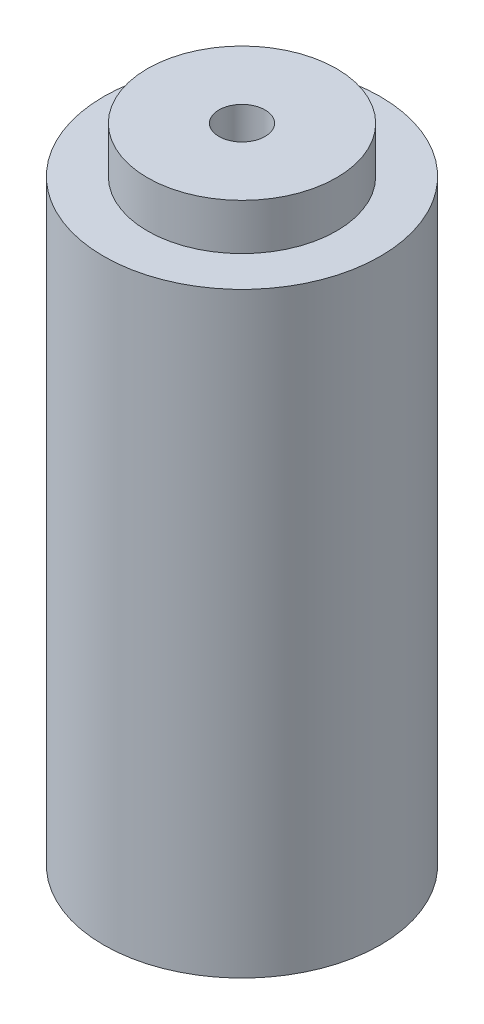
ISO-10303-21;
HEADER;
FILE_DESCRIPTION(('STEP AP214'),'2;1');
FILE_NAME('part.step','',(''),(''),'','','');
FILE_SCHEMA(('AUTOMOTIVE_DESIGN { 1 0 10303 214 1 1 1 1 }'));
ENDSEC;
DATA;
#1=APPLICATION_CONTEXT('core data for automotive mechanical design processes');
#2=APPLICATION_PROTOCOL_DEFINITION('international standard','automotive_design',2000,#1);
#3=PRODUCT_CONTEXT('',#1,'mechanical');
#4=PRODUCT('Part','Part','',(#3));
#5=PRODUCT_RELATED_PRODUCT_CATEGORY('part','',(#4));
#6=PRODUCT_DEFINITION_FORMATION('','',#4);
#7=PRODUCT_DEFINITION_CONTEXT('part definition',#1,'design');
#8=PRODUCT_DEFINITION('design','',#6,#7);
#9=PRODUCT_DEFINITION_SHAPE('','',#8);
#10=(LENGTH_UNIT() NAMED_UNIT(*) SI_UNIT(.MILLI.,.METRE.));
#11=(NAMED_UNIT(*) PLANE_ANGLE_UNIT() SI_UNIT($,.RADIAN.));
#12=(NAMED_UNIT(*) SI_UNIT($,.STERADIAN.) SOLID_ANGLE_UNIT());
#13=UNCERTAINTY_MEASURE_WITH_UNIT(LENGTH_MEASURE(1.E-05),#10,'distance_accuracy_value','');
#14=(GEOMETRIC_REPRESENTATION_CONTEXT(3) GLOBAL_UNCERTAINTY_ASSIGNED_CONTEXT((#13)) GLOBAL_UNIT_ASSIGNED_CONTEXT((#10,
#11,#12)) REPRESENTATION_CONTEXT('',''));
#15=CARTESIAN_POINT('',(0.,0.,0.));
#16=DIRECTION('',(0.,0.,1.));
#17=DIRECTION('',(1.,0.,0.));
#18=AXIS2_PLACEMENT_3D('',#15,#16,#17);
#19=CARTESIAN_POINT('',(0.,38.8,0.));
#20=DIRECTION('',(0.,1.,0.));
#21=DIRECTION('',(0.,0.,1.));
#22=AXIS2_PLACEMENT_3D('',#19,#20,#21);
#23=PLANE('',#22);
#24=CARTESIAN_POINT('',(0.,38.8,0.));
#25=DIRECTION('',(0.,1.,0.));
#26=DIRECTION('',(0.,0.,1.));
#27=AXIS2_PLACEMENT_3D('',#24,#25,#26);
#28=CIRCLE('',#27,9.);
#29=CARTESIAN_POINT('',(0.,38.8,9.));
#30=VERTEX_POINT('',#29);
#31=EDGE_CURVE('E10',#30,#30,#28,.T.);
#32=ORIENTED_EDGE('',*,*,#31,.T.);
#33=EDGE_LOOP('',(#32));
#34=FACE_BOUND('',#33,.T.);
#35=CARTESIAN_POINT('',(0.,38.8,0.));
#36=DIRECTION('',(0.,1.,0.));
#37=DIRECTION('',(0.,0.,1.));
#38=AXIS2_PLACEMENT_3D('',#35,#36,#37);
#39=CIRCLE('',#38,6.15);
#40=CARTESIAN_POINT('',(0.,38.8,6.15));
#41=VERTEX_POINT('',#40);
#42=EDGE_CURVE('E45',#41,#41,#39,.T.);
#43=ORIENTED_EDGE('',*,*,#42,.F.);
#44=EDGE_LOOP('',(#43));
#45=FACE_BOUND('',#44,.T.);
#46=ADVANCED_FACE('F34',(#34,#45),#23,.T.);
#47=CARTESIAN_POINT('',(0.,0.,0.));
#48=DIRECTION('',(0.,1.,0.));
#49=DIRECTION('',(0.,0.,1.));
#50=AXIS2_PLACEMENT_3D('',#47,#48,#49);
#51=PLANE('',#50);
#52=CARTESIAN_POINT('',(0.,0.,0.));
#53=DIRECTION('',(0.,1.,0.));
#54=DIRECTION('',(0.,0.,1.));
#55=AXIS2_PLACEMENT_3D('',#52,#53,#54);
#56=CIRCLE('',#55,1.5);
#57=CARTESIAN_POINT('',(0.,0.,1.5));
#58=VERTEX_POINT('',#57);
#59=EDGE_CURVE('E52',#58,#58,#56,.T.);
#60=ORIENTED_EDGE('',*,*,#59,.T.);
#61=EDGE_LOOP('',(#60));
#62=FACE_BOUND('',#61,.T.);
#63=CARTESIAN_POINT('',(0.,0.,0.));
#64=DIRECTION('',(0.,1.,0.));
#65=DIRECTION('',(0.,0.,1.));
#66=AXIS2_PLACEMENT_3D('',#63,#64,#65);
#67=CIRCLE('',#66,9.);
#68=CARTESIAN_POINT('',(0.,0.,9.));
#69=VERTEX_POINT('',#68);
#70=EDGE_CURVE('E38',#69,#69,#67,.T.);
#71=ORIENTED_EDGE('',*,*,#70,.F.);
#72=EDGE_LOOP('',(#71));
#73=FACE_BOUND('',#72,.T.);
#74=ADVANCED_FACE('F59',(#62,#73),#51,.F.);
#75=CARTESIAN_POINT('',(0.,38.8,0.));
#76=DIRECTION('',(0.,-1.,0.));
#77=DIRECTION('',(0.,0.,-1.));
#78=AXIS2_PLACEMENT_3D('',#75,#76,#77);
#79=CYLINDRICAL_SURFACE('',#78,9.);
#80=ORIENTED_EDGE('',*,*,#31,.F.);
#81=EDGE_LOOP('',(#80));
#82=FACE_BOUND('',#81,.T.);
#83=ORIENTED_EDGE('',*,*,#70,.T.);
#84=EDGE_LOOP('',(#83));
#85=FACE_BOUND('',#84,.T.);
#86=ADVANCED_FACE('F36',(#82,#85),#79,.T.);
#87=CARTESIAN_POINT('',(0.,41.8,0.));
#88=DIRECTION('',(0.,-1.,0.));
#89=DIRECTION('',(0.,0.,-1.));
#90=AXIS2_PLACEMENT_3D('',#87,#88,#89);
#91=CYLINDRICAL_SURFACE('',#90,6.15);
#92=ORIENTED_EDGE('',*,*,#42,.T.);
#93=EDGE_LOOP('',(#92));
#94=FACE_BOUND('',#93,.T.);
#95=CARTESIAN_POINT('',(0.,41.8,0.));
#96=DIRECTION('',(0.,1.,0.));
#97=DIRECTION('',(0.,0.,1.));
#98=AXIS2_PLACEMENT_3D('',#95,#96,#97);
#99=CIRCLE('',#98,6.15);
#100=CARTESIAN_POINT('',(0.,41.8,6.15));
#101=VERTEX_POINT('',#100);
#102=EDGE_CURVE('E49',#101,#101,#99,.T.);
#103=ORIENTED_EDGE('',*,*,#102,.F.);
#104=EDGE_LOOP('',(#103));
#105=FACE_BOUND('',#104,.T.);
#106=ADVANCED_FACE('F71',(#94,#105),#91,.T.);
#107=CARTESIAN_POINT('',(0.,41.8,0.));
#108=DIRECTION('',(0.,1.,0.));
#109=DIRECTION('',(0.,0.,1.));
#110=AXIS2_PLACEMENT_3D('',#107,#108,#109);
#111=PLANE('',#110);
#112=CARTESIAN_POINT('',(0.,41.8,0.));
#113=DIRECTION('',(0.,1.,0.));
#114=DIRECTION('',(0.,0.,1.));
#115=AXIS2_PLACEMENT_3D('',#112,#113,#114);
#116=CIRCLE('',#115,1.5);
#117=CARTESIAN_POINT('',(0.,41.8,1.5));
#118=VERTEX_POINT('',#117);
#119=EDGE_CURVE('E53',#118,#118,#116,.T.);
#120=ORIENTED_EDGE('',*,*,#119,.F.);
#121=EDGE_LOOP('',(#120));
#122=FACE_BOUND('',#121,.T.);
#123=ORIENTED_EDGE('',*,*,#102,.T.);
#124=EDGE_LOOP('',(#123));
#125=FACE_BOUND('',#124,.T.);
#126=ADVANCED_FACE('F65',(#122,#125),#111,.T.);
#127=CARTESIAN_POINT('',(0.,0.,0.));
#128=DIRECTION('',(0.,1.,0.));
#129=DIRECTION('',(0.,0.,1.));
#130=AXIS2_PLACEMENT_3D('',#127,#128,#129);
#131=CYLINDRICAL_SURFACE('',#130,1.5);
#132=ORIENTED_EDGE('',*,*,#59,.F.);
#133=EDGE_LOOP('',(#132));
#134=FACE_BOUND('',#133,.T.);
#135=ORIENTED_EDGE('',*,*,#119,.T.);
#136=EDGE_LOOP('',(#135));
#137=FACE_BOUND('',#136,.T.);
#138=ADVANCED_FACE('F62',(#134,#137),#131,.F.);
#139=CLOSED_SHELL('',(#46,#74,#86,#106,#126,#138));
#140=MANIFOLD_SOLID_BREP('B2',#139);
#141=ADVANCED_BREP_SHAPE_REPRESENTATION('',(#18,#140),#14);
#142=SHAPE_DEFINITION_REPRESENTATION(#9,#141);
ENDSEC;
END-ISO-10303-21;
